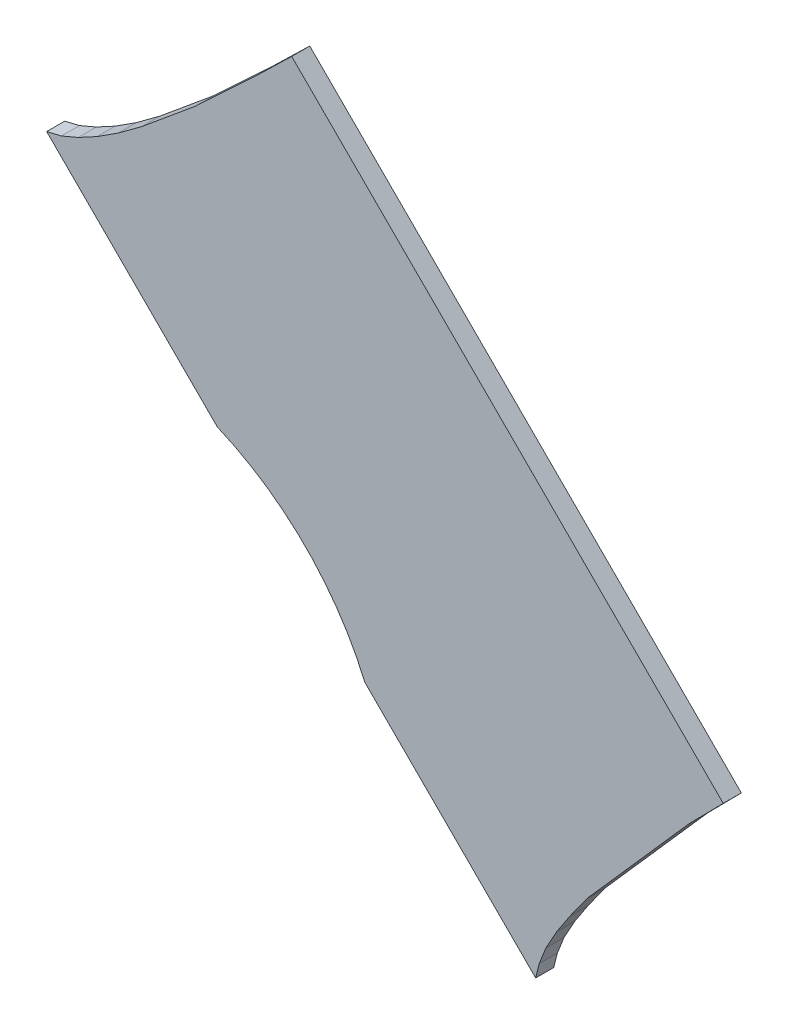
ISO-10303-21;
HEADER;
FILE_DESCRIPTION(('STEP AP214'),'2;1');
FILE_NAME('part.step','',(''),(''),'','','');
FILE_SCHEMA(('AUTOMOTIVE_DESIGN { 1 0 10303 214 1 1 1 1 }'));
ENDSEC;
DATA;
#1=APPLICATION_CONTEXT('core data for automotive mechanical design processes');
#2=APPLICATION_PROTOCOL_DEFINITION('international standard','automotive_design',2000,#1);
#3=PRODUCT_CONTEXT('',#1,'mechanical');
#4=PRODUCT('Part','Part','',(#3));
#5=PRODUCT_RELATED_PRODUCT_CATEGORY('part','',(#4));
#6=PRODUCT_DEFINITION_FORMATION('','',#4);
#7=PRODUCT_DEFINITION_CONTEXT('part definition',#1,'design');
#8=PRODUCT_DEFINITION('design','',#6,#7);
#9=PRODUCT_DEFINITION_SHAPE('','',#8);
#10=(LENGTH_UNIT() NAMED_UNIT(*) SI_UNIT(.MILLI.,.METRE.));
#11=(NAMED_UNIT(*) PLANE_ANGLE_UNIT() SI_UNIT($,.RADIAN.));
#12=(NAMED_UNIT(*) SI_UNIT($,.STERADIAN.) SOLID_ANGLE_UNIT());
#13=UNCERTAINTY_MEASURE_WITH_UNIT(LENGTH_MEASURE(1.E-05),#10,'distance_accuracy_value','');
#14=(GEOMETRIC_REPRESENTATION_CONTEXT(3) GLOBAL_UNCERTAINTY_ASSIGNED_CONTEXT((#13)) GLOBAL_UNIT_ASSIGNED_CONTEXT((#10,
#11,#12)) REPRESENTATION_CONTEXT('',''));
#15=CARTESIAN_POINT('',(0.,0.,0.));
#16=DIRECTION('',(0.,0.,1.));
#17=DIRECTION('',(1.,0.,0.));
#18=AXIS2_PLACEMENT_3D('',#15,#16,#17);
#19=CARTESIAN_POINT('',(97.9150009155273,57.5989990234375,0.));
#20=DIRECTION('',(-0.706690206684728,-0.707523110418236,0.));
#21=DIRECTION('',(-0.707523110418236,0.706690206684728,0.));
#22=AXIS2_PLACEMENT_3D('',#19,#20,#21);
#23=PLANE('',#22);
#24=DIRECTION('',(-0.707523110418236,0.706690206684728,0.));
#25=VECTOR('',#24,1.);
#26=CARTESIAN_POINT('',(97.9150009155273,57.5989990234375,0.03556));
#27=LINE('',#26,#25);
#28=CARTESIAN_POINT('',(97.9150009155273,57.5989990234375,0.03556));
#29=VERTEX_POINT('',#28);
#30=CARTESIAN_POINT('',(97.0660018920898,58.4469985961914,0.03556));
#31=VERTEX_POINT('',#30);
#32=EDGE_CURVE('E11',#29,#31,#27,.T.);
#33=ORIENTED_EDGE('',*,*,#32,.F.);
#34=DIRECTION('',(0.,0.,1.));
#35=VECTOR('',#34,1.);
#36=CARTESIAN_POINT('',(97.9150009155273,57.5989990234375,0.));
#37=LINE('',#36,#35);
#38=CARTESIAN_POINT('',(97.9150009155273,57.5989990234375,0.));
#39=VERTEX_POINT('',#38);
#40=EDGE_CURVE('E24',#39,#29,#37,.T.);
#41=ORIENTED_EDGE('',*,*,#40,.F.);
#42=DIRECTION('',(-0.707523110418236,0.706690206684728,0.));
#43=VECTOR('',#42,1.);
#44=CARTESIAN_POINT('',(97.9150009155273,57.5989990234375,0.));
#45=LINE('',#44,#43);
#46=CARTESIAN_POINT('',(97.0660018920898,58.4469985961914,0.));
#47=VERTEX_POINT('',#46);
#48=EDGE_CURVE('E297',#39,#47,#45,.T.);
#49=ORIENTED_EDGE('',*,*,#48,.T.);
#50=DIRECTION('',(0.,0.,1.));
#51=VECTOR('',#50,1.);
#52=CARTESIAN_POINT('',(97.0660018920898,58.4469985961914,0.));
#53=LINE('',#52,#51);
#54=EDGE_CURVE('E37',#47,#31,#53,.T.);
#55=ORIENTED_EDGE('',*,*,#54,.T.);
#56=EDGE_LOOP('',(#33,#41,#49,#55));
#57=FACE_BOUND('',#56,.T.);
#58=ADVANCED_FACE('F17',(#57),#23,.F.);
#59=CARTESIAN_POINT('',(97.8479995727539,57.5309982299805,0.));
#60=DIRECTION('',(-0.712322129038373,0.701852680042072,0.));
#61=DIRECTION('',(0.701852680042072,0.712322129038373,0.));
#62=AXIS2_PLACEMENT_3D('',#59,#60,#61);
#63=PLANE('',#62);
#64=DIRECTION('',(0.701852680042072,0.712322129038373,0.));
#65=VECTOR('',#64,1.);
#66=CARTESIAN_POINT('',(97.8479995727539,57.5309982299805,0.03556));
#67=LINE('',#66,#65);
#68=CARTESIAN_POINT('',(97.8479995727539,57.5309982299805,0.03556));
#69=VERTEX_POINT('',#68);
#70=EDGE_CURVE('E293',#69,#29,#67,.T.);
#71=ORIENTED_EDGE('',*,*,#70,.F.);
#72=DIRECTION('',(0.,0.,1.));
#73=VECTOR('',#72,1.);
#74=CARTESIAN_POINT('',(97.8479995727539,57.5309982299805,0.));
#75=LINE('',#74,#73);
#76=CARTESIAN_POINT('',(97.8479995727539,57.5309982299805,0.));
#77=VERTEX_POINT('',#76);
#78=EDGE_CURVE('E291',#77,#69,#75,.T.);
#79=ORIENTED_EDGE('',*,*,#78,.F.);
#80=DIRECTION('',(0.701852680042072,0.712322129038373,0.));
#81=VECTOR('',#80,1.);
#82=CARTESIAN_POINT('',(97.8479995727539,57.5309982299805,0.));
#83=LINE('',#82,#81);
#84=EDGE_CURVE('E289',#77,#39,#83,.T.);
#85=ORIENTED_EDGE('',*,*,#84,.T.);
#86=ORIENTED_EDGE('',*,*,#40,.T.);
#87=EDGE_LOOP('',(#71,#79,#85,#86));
#88=FACE_BOUND('',#87,.T.);
#89=ADVANCED_FACE('F300',(#88),#63,.F.);
#90=CARTESIAN_POINT('',(97.6470031738281,57.3030014038086,0.));
#91=DIRECTION('',(-0.750127132256112,0.661293645405142,0.));
#92=DIRECTION('',(0.661293645405142,0.750127132256112,0.));
#93=AXIS2_PLACEMENT_3D('',#90,#91,#92);
#94=PLANE('',#93);
#95=DIRECTION('',(0.661293645405142,0.750127132256112,0.));
#96=VECTOR('',#95,1.);
#97=CARTESIAN_POINT('',(97.6470031738281,57.3030014038086,0.03556));
#98=LINE('',#97,#96);
#99=CARTESIAN_POINT('',(97.6470031738281,57.3030014038086,0.03556));
#100=VERTEX_POINT('',#99);
#101=EDGE_CURVE('E286',#100,#69,#98,.T.);
#102=ORIENTED_EDGE('',*,*,#101,.F.);
#103=DIRECTION('',(0.,0.,1.));
#104=VECTOR('',#103,1.);
#105=CARTESIAN_POINT('',(97.6470031738281,57.3030014038086,0.));
#106=LINE('',#105,#104);
#107=CARTESIAN_POINT('',(97.6470031738281,57.3030014038086,0.));
#108=VERTEX_POINT('',#107);
#109=EDGE_CURVE('E284',#108,#100,#106,.T.);
#110=ORIENTED_EDGE('',*,*,#109,.F.);
#111=DIRECTION('',(0.661293645405142,0.750127132256112,0.));
#112=VECTOR('',#111,1.);
#113=CARTESIAN_POINT('',(97.6470031738281,57.3030014038086,0.));
#114=LINE('',#113,#112);
#115=EDGE_CURVE('E281',#108,#77,#114,.T.);
#116=ORIENTED_EDGE('',*,*,#115,.T.);
#117=ORIENTED_EDGE('',*,*,#78,.T.);
#118=EDGE_LOOP('',(#102,#110,#116,#117));
#119=FACE_BOUND('',#118,.T.);
#120=ADVANCED_FACE('F303',(#119),#94,.F.);
#121=CARTESIAN_POINT('',(97.6139984130859,57.2569999694824,0.));
#122=DIRECTION('',(-0.81250703080477,0.582951391535191,0.));
#123=DIRECTION('',(0.582951391535191,0.81250703080477,0.));
#124=AXIS2_PLACEMENT_3D('',#121,#122,#123);
#125=PLANE('',#124);
#126=DIRECTION('',(0.582951391535191,0.81250703080477,0.));
#127=VECTOR('',#126,1.);
#128=CARTESIAN_POINT('',(97.6139984130859,57.2569999694824,0.03556));
#129=LINE('',#128,#127);
#130=CARTESIAN_POINT('',(97.6139984130859,57.2569999694824,0.03556));
#131=VERTEX_POINT('',#130);
#132=EDGE_CURVE('E278',#131,#100,#129,.T.);
#133=ORIENTED_EDGE('',*,*,#132,.F.);
#134=DIRECTION('',(0.,0.,1.));
#135=VECTOR('',#134,1.);
#136=CARTESIAN_POINT('',(97.6139984130859,57.2569999694824,0.));
#137=LINE('',#136,#135);
#138=CARTESIAN_POINT('',(97.6139984130859,57.2569999694824,0.));
#139=VERTEX_POINT('',#138);
#140=EDGE_CURVE('E276',#139,#131,#137,.T.);
#141=ORIENTED_EDGE('',*,*,#140,.F.);
#142=DIRECTION('',(0.582951391535191,0.81250703080477,0.));
#143=VECTOR('',#142,1.);
#144=CARTESIAN_POINT('',(97.6139984130859,57.2569999694824,0.));
#145=LINE('',#144,#143);
#146=EDGE_CURVE('E273',#139,#108,#145,.T.);
#147=ORIENTED_EDGE('',*,*,#146,.T.);
#148=ORIENTED_EDGE('',*,*,#109,.T.);
#149=EDGE_LOOP('',(#133,#141,#147,#148));
#150=FACE_BOUND('',#149,.T.);
#151=ADVANCED_FACE('F308',(#150),#125,.F.);
#152=CARTESIAN_POINT('',(97.5869979858398,57.2159996032715,0.));
#153=DIRECTION('',(-0.835169123716599,0.549993213403991,0.));
#154=DIRECTION('',(0.549993213403991,0.835169123716599,0.));
#155=AXIS2_PLACEMENT_3D('',#152,#153,#154);
#156=PLANE('',#155);
#157=DIRECTION('',(0.549993213403991,0.835169123716599,0.));
#158=VECTOR('',#157,1.);
#159=CARTESIAN_POINT('',(97.5869979858398,57.2159996032715,0.03556));
#160=LINE('',#159,#158);
#161=CARTESIAN_POINT('',(97.5869979858398,57.2159996032715,0.03556));
#162=VERTEX_POINT('',#161);
#163=EDGE_CURVE('E270',#162,#131,#160,.T.);
#164=ORIENTED_EDGE('',*,*,#163,.F.);
#165=DIRECTION('',(0.,0.,1.));
#166=VECTOR('',#165,1.);
#167=CARTESIAN_POINT('',(97.5869979858398,57.2159996032715,0.));
#168=LINE('',#167,#166);
#169=CARTESIAN_POINT('',(97.5869979858398,57.2159996032715,0.));
#170=VERTEX_POINT('',#169);
#171=EDGE_CURVE('E268',#170,#162,#168,.T.);
#172=ORIENTED_EDGE('',*,*,#171,.F.);
#173=DIRECTION('',(0.549993213403991,0.835169123716599,0.));
#174=VECTOR('',#173,1.);
#175=CARTESIAN_POINT('',(97.5869979858398,57.2159996032715,0.));
#176=LINE('',#175,#174);
#177=EDGE_CURVE('E265',#170,#139,#176,.T.);
#178=ORIENTED_EDGE('',*,*,#177,.T.);
#179=ORIENTED_EDGE('',*,*,#140,.T.);
#180=EDGE_LOOP('',(#164,#172,#178,#179));
#181=FACE_BOUND('',#180,.T.);
#182=ADVANCED_FACE('F311',(#181),#156,.F.);
#183=CARTESIAN_POINT('',(97.5660018920898,57.1780014038086,0.));
#184=DIRECTION('',(-0.875269922598905,0.4836347408879,0.));
#185=DIRECTION('',(0.4836347408879,0.875269922598905,0.));
#186=AXIS2_PLACEMENT_3D('',#183,#184,#185);
#187=PLANE('',#186);
#188=DIRECTION('',(0.4836347408879,0.875269922598905,0.));
#189=VECTOR('',#188,1.);
#190=CARTESIAN_POINT('',(97.5660018920898,57.1780014038086,0.03556));
#191=LINE('',#190,#189);
#192=CARTESIAN_POINT('',(97.5660018920898,57.1780014038086,0.03556));
#193=VERTEX_POINT('',#192);
#194=EDGE_CURVE('E262',#193,#162,#191,.T.);
#195=ORIENTED_EDGE('',*,*,#194,.F.);
#196=DIRECTION('',(0.,0.,1.));
#197=VECTOR('',#196,1.);
#198=CARTESIAN_POINT('',(97.5660018920898,57.1780014038086,0.));
#199=LINE('',#198,#197);
#200=CARTESIAN_POINT('',(97.5660018920898,57.1780014038086,0.));
#201=VERTEX_POINT('',#200);
#202=EDGE_CURVE('E260',#201,#193,#199,.T.);
#203=ORIENTED_EDGE('',*,*,#202,.F.);
#204=DIRECTION('',(0.4836347408879,0.875269922598905,0.));
#205=VECTOR('',#204,1.);
#206=CARTESIAN_POINT('',(97.5660018920898,57.1780014038086,0.));
#207=LINE('',#206,#205);
#208=EDGE_CURVE('E257',#201,#170,#207,.T.);
#209=ORIENTED_EDGE('',*,*,#208,.T.);
#210=ORIENTED_EDGE('',*,*,#171,.T.);
#211=EDGE_LOOP('',(#195,#203,#209,#210));
#212=FACE_BOUND('',#211,.T.);
#213=ADVANCED_FACE('F316',(#212),#187,.F.);
#214=CARTESIAN_POINT('',(97.5530014038086,57.1450004577637,0.));
#215=DIRECTION('',(-0.930407281415099,0.36652733962116,0.));
#216=DIRECTION('',(0.36652733962116,0.930407281415099,0.));
#217=AXIS2_PLACEMENT_3D('',#214,#215,#216);
#218=PLANE('',#217);
#219=DIRECTION('',(0.36652733962116,0.930407281415099,0.));
#220=VECTOR('',#219,1.);
#221=CARTESIAN_POINT('',(97.5530014038086,57.1450004577637,0.03556));
#222=LINE('',#221,#220);
#223=CARTESIAN_POINT('',(97.5530014038086,57.1450004577637,0.03556));
#224=VERTEX_POINT('',#223);
#225=EDGE_CURVE('E254',#224,#193,#222,.T.);
#226=ORIENTED_EDGE('',*,*,#225,.F.);
#227=DIRECTION('',(0.,0.,1.));
#228=VECTOR('',#227,1.);
#229=CARTESIAN_POINT('',(97.5530014038086,57.1450004577637,0.));
#230=LINE('',#229,#228);
#231=CARTESIAN_POINT('',(97.5530014038086,57.1450004577637,0.));
#232=VERTEX_POINT('',#231);
#233=EDGE_CURVE('E252',#232,#224,#230,.T.);
#234=ORIENTED_EDGE('',*,*,#233,.F.);
#235=DIRECTION('',(0.36652733962116,0.930407281415099,0.));
#236=VECTOR('',#235,1.);
#237=CARTESIAN_POINT('',(97.5530014038086,57.1450004577637,0.));
#238=LINE('',#237,#236);
#239=EDGE_CURVE('E249',#232,#201,#238,.T.);
#240=ORIENTED_EDGE('',*,*,#239,.T.);
#241=ORIENTED_EDGE('',*,*,#202,.T.);
#242=EDGE_LOOP('',(#226,#234,#240,#241));
#243=FACE_BOUND('',#242,.T.);
#244=ADVANCED_FACE('F319',(#243),#218,.F.);
#245=CARTESIAN_POINT('',(97.5459976196289,57.117000579834,0.));
#246=DIRECTION('',(-0.970111393872779,0.242660016233028,0.));
#247=DIRECTION('',(0.242660016233028,0.970111393872779,0.));
#248=AXIS2_PLACEMENT_3D('',#245,#246,#247);
#249=PLANE('',#248);
#250=DIRECTION('',(0.242660016233028,0.970111393872779,0.));
#251=VECTOR('',#250,1.);
#252=CARTESIAN_POINT('',(97.5459976196289,57.117000579834,0.03556));
#253=LINE('',#252,#251);
#254=CARTESIAN_POINT('',(97.5459976196289,57.117000579834,0.03556));
#255=VERTEX_POINT('',#254);
#256=EDGE_CURVE('E246',#255,#224,#253,.T.);
#257=ORIENTED_EDGE('',*,*,#256,.F.);
#258=DIRECTION('',(0.,0.,1.));
#259=VECTOR('',#258,1.);
#260=CARTESIAN_POINT('',(97.5459976196289,57.117000579834,0.));
#261=LINE('',#260,#259);
#262=CARTESIAN_POINT('',(97.5459976196289,57.117000579834,0.));
#263=VERTEX_POINT('',#262);
#264=EDGE_CURVE('E244',#263,#255,#261,.T.);
#265=ORIENTED_EDGE('',*,*,#264,.F.);
#266=DIRECTION('',(0.242660016233028,0.970111393872779,0.));
#267=VECTOR('',#266,1.);
#268=CARTESIAN_POINT('',(97.5459976196289,57.117000579834,0.));
#269=LINE('',#268,#267);
#270=EDGE_CURVE('E241',#263,#232,#269,.T.);
#271=ORIENTED_EDGE('',*,*,#270,.T.);
#272=ORIENTED_EDGE('',*,*,#233,.T.);
#273=EDGE_LOOP('',(#257,#265,#271,#272));
#274=FACE_BOUND('',#273,.T.);
#275=ADVANCED_FACE('F324',(#274),#249,.F.);
#276=CARTESIAN_POINT('',(97.2099402488561,57.4527088097833,0.));
#277=DIRECTION('',(0.70673917682214,0.707474194543351,0.));
#278=DIRECTION('',(0.707474194543351,-0.70673917682214,0.));
#279=AXIS2_PLACEMENT_3D('',#276,#277,#278);
#280=PLANE('',#279);
#281=DIRECTION('',(0.707474194543351,-0.70673917682214,0.));
#282=VECTOR('',#281,1.);
#283=CARTESIAN_POINT('',(96.5839996337891,58.0779991149902,0.03556));
#284=LINE('',#283,#282);
#285=CARTESIAN_POINT('',(97.2099402488561,57.4527088097833,0.03556));
#286=VERTEX_POINT('',#285);
#287=EDGE_CURVE('E238',#286,#255,#284,.T.);
#288=ORIENTED_EDGE('',*,*,#287,.F.);
#289=DIRECTION('',(0.,0.,1.));
#290=VECTOR('',#289,1.);
#291=CARTESIAN_POINT('',(97.2099402488561,57.4527088097833,0.));
#292=LINE('',#291,#290);
#293=CARTESIAN_POINT('',(97.2099402488561,57.4527088097833,0.));
#294=VERTEX_POINT('',#293);
#295=EDGE_CURVE('E236',#294,#286,#292,.T.);
#296=ORIENTED_EDGE('',*,*,#295,.F.);
#297=DIRECTION('',(0.707474194543351,-0.70673917682214,0.));
#298=VECTOR('',#297,1.);
#299=CARTESIAN_POINT('',(96.5839996337891,58.0779991149902,0.));
#300=LINE('',#299,#298);
#301=EDGE_CURVE('E233',#294,#263,#300,.T.);
#302=ORIENTED_EDGE('',*,*,#301,.T.);
#303=ORIENTED_EDGE('',*,*,#264,.T.);
#304=EDGE_LOOP('',(#288,#296,#302,#303));
#305=FACE_BOUND('',#304,.T.);
#306=ADVANCED_FACE('F327',(#305),#280,.F.);
#307=CARTESIAN_POINT('',(96.70415,57.2366648,0.));
#308=DIRECTION('',(0.,0.,-1.));
#309=DIRECTION('',(1.,0.,0.));
#310=AXIS2_PLACEMENT_3D('',#307,#308,#309);
#311=CYLINDRICAL_SURFACE('',#310,0.5499989);
#312=ORIENTED_EDGE('',*,*,#295,.T.);
#313=CARTESIAN_POINT('',(96.70415,57.2366648,0.03556));
#314=DIRECTION('',(0.,0.,1.));
#315=DIRECTION('',(1.,0.,0.));
#316=AXIS2_PLACEMENT_3D('',#313,#314,#315);
#317=CIRCLE('',#316,0.5499989);
#318=CARTESIAN_POINT('',(96.9196681383196,57.7426793472775,0.03556));
#319=VERTEX_POINT('',#318);
#320=EDGE_CURVE('E230',#286,#319,#317,.T.);
#321=ORIENTED_EDGE('',*,*,#320,.T.);
#322=DIRECTION('',(0.,0.,1.));
#323=VECTOR('',#322,1.);
#324=CARTESIAN_POINT('',(96.9196681383196,57.7426793472775,0.));
#325=LINE('',#324,#323);
#326=CARTESIAN_POINT('',(96.9196681383196,57.7426793472775,0.));
#327=VERTEX_POINT('',#326);
#328=EDGE_CURVE('E228',#327,#319,#325,.T.);
#329=ORIENTED_EDGE('',*,*,#328,.F.);
#330=CARTESIAN_POINT('',(96.70415,57.2366648,0.));
#331=DIRECTION('',(0.,0.,1.));
#332=DIRECTION('',(1.,0.,0.));
#333=AXIS2_PLACEMENT_3D('',#330,#331,#332);
#334=CIRCLE('',#333,0.5499989);
#335=EDGE_CURVE('E225',#294,#327,#334,.T.);
#336=ORIENTED_EDGE('',*,*,#335,.F.);
#337=EDGE_LOOP('',(#312,#321,#329,#336));
#338=FACE_BOUND('',#337,.T.);
#339=ADVANCED_FACE('F333',(#338),#311,.F.);
#340=CARTESIAN_POINT('',(96.5839996337891,58.0779991149902,0.));
#341=DIRECTION('',(0.70673917682214,0.707474194543351,0.));
#342=DIRECTION('',(0.707474194543351,-0.70673917682214,0.));
#343=AXIS2_PLACEMENT_3D('',#340,#341,#342);
#344=PLANE('',#343);
#345=DIRECTION('',(0.707474194543351,-0.70673917682214,0.));
#346=VECTOR('',#345,1.);
#347=CARTESIAN_POINT('',(96.5839996337891,58.0779991149902,0.03556));
#348=LINE('',#347,#346);
#349=CARTESIAN_POINT('',(96.5839996337891,58.0779991149902,0.03556));
#350=VERTEX_POINT('',#349);
#351=EDGE_CURVE('E222',#350,#319,#348,.T.);
#352=ORIENTED_EDGE('',*,*,#351,.F.);
#353=DIRECTION('',(0.,0.,1.));
#354=VECTOR('',#353,1.);
#355=CARTESIAN_POINT('',(96.5839996337891,58.0779991149902,0.));
#356=LINE('',#355,#354);
#357=CARTESIAN_POINT('',(96.5839996337891,58.0779991149902,0.));
#358=VERTEX_POINT('',#357);
#359=EDGE_CURVE('E220',#358,#350,#356,.T.);
#360=ORIENTED_EDGE('',*,*,#359,.F.);
#361=EDGE_CURVE('E219',#358,#327,#300,.T.);
#362=ORIENTED_EDGE('',*,*,#361,.T.);
#363=ORIENTED_EDGE('',*,*,#328,.T.);
#364=EDGE_LOOP('',(#352,#360,#362,#363));
#365=FACE_BOUND('',#364,.T.);
#366=ADVANCED_FACE('F336',(#365),#344,.F.);
#367=CARTESIAN_POINT('',(96.6129989624023,58.0849990844727,0.));
#368=DIRECTION('',(0.234644699710009,-0.972081202831327,0.));
#369=DIRECTION('',(-0.972081202831327,-0.234644699710009,0.));
#370=AXIS2_PLACEMENT_3D('',#367,#368,#369);
#371=PLANE('',#370);
#372=DIRECTION('',(-0.972081202831327,-0.234644699710009,0.));
#373=VECTOR('',#372,1.);
#374=CARTESIAN_POINT('',(96.6129989624023,58.0849990844727,0.03556));
#375=LINE('',#374,#373);
#376=CARTESIAN_POINT('',(96.6129989624023,58.0849990844727,0.03556));
#377=VERTEX_POINT('',#376);
#378=EDGE_CURVE('E216',#377,#350,#375,.T.);
#379=ORIENTED_EDGE('',*,*,#378,.F.);
#380=DIRECTION('',(0.,0.,1.));
#381=VECTOR('',#380,1.);
#382=CARTESIAN_POINT('',(96.6129989624023,58.0849990844727,0.));
#383=LINE('',#382,#381);
#384=CARTESIAN_POINT('',(96.6129989624023,58.0849990844727,0.));
#385=VERTEX_POINT('',#384);
#386=EDGE_CURVE('E214',#385,#377,#383,.T.);
#387=ORIENTED_EDGE('',*,*,#386,.F.);
#388=DIRECTION('',(-0.972081202831327,-0.234644699710009,0.));
#389=VECTOR('',#388,1.);
#390=CARTESIAN_POINT('',(96.6129989624023,58.0849990844727,0.));
#391=LINE('',#390,#389);
#392=EDGE_CURVE('E211',#385,#358,#391,.T.);
#393=ORIENTED_EDGE('',*,*,#392,.T.);
#394=ORIENTED_EDGE('',*,*,#359,.T.);
#395=EDGE_LOOP('',(#379,#387,#393,#394));
#396=FACE_BOUND('',#395,.T.);
#397=ADVANCED_FACE('F341',(#396),#371,.F.);
#398=CARTESIAN_POINT('',(96.6460037231445,58.0989990234375,0.));
#399=DIRECTION('',(0.390500660579544,-0.920602647230031,0.));
#400=DIRECTION('',(-0.920602647230031,-0.390500660579544,0.));
#401=AXIS2_PLACEMENT_3D('',#398,#399,#400);
#402=PLANE('',#401);
#403=DIRECTION('',(-0.920602647230031,-0.390500660579544,0.));
#404=VECTOR('',#403,1.);
#405=CARTESIAN_POINT('',(96.6460037231445,58.0989990234375,0.03556));
#406=LINE('',#405,#404);
#407=CARTESIAN_POINT('',(96.6460037231445,58.0989990234375,0.03556));
#408=VERTEX_POINT('',#407);
#409=EDGE_CURVE('E208',#408,#377,#406,.T.);
#410=ORIENTED_EDGE('',*,*,#409,.F.);
#411=DIRECTION('',(0.,0.,1.));
#412=VECTOR('',#411,1.);
#413=CARTESIAN_POINT('',(96.6460037231445,58.0989990234375,0.));
#414=LINE('',#413,#412);
#415=CARTESIAN_POINT('',(96.6460037231445,58.0989990234375,0.));
#416=VERTEX_POINT('',#415);
#417=EDGE_CURVE('E206',#416,#408,#414,.T.);
#418=ORIENTED_EDGE('',*,*,#417,.F.);
#419=DIRECTION('',(-0.920602647230031,-0.390500660579544,0.));
#420=VECTOR('',#419,1.);
#421=CARTESIAN_POINT('',(96.6460037231445,58.0989990234375,0.));
#422=LINE('',#421,#420);
#423=EDGE_CURVE('E203',#416,#385,#422,.T.);
#424=ORIENTED_EDGE('',*,*,#423,.T.);
#425=ORIENTED_EDGE('',*,*,#386,.T.);
#426=EDGE_LOOP('',(#410,#418,#424,#425));
#427=FACE_BOUND('',#426,.T.);
#428=ADVANCED_FACE('F344',(#427),#402,.F.);
#429=CARTESIAN_POINT('',(96.6829986572266,58.1189994812012,0.));
#430=DIRECTION('',(0.475575846598537,-0.879674720639445,0.));
#431=DIRECTION('',(-0.879674720639445,-0.475575846598537,0.));
#432=AXIS2_PLACEMENT_3D('',#429,#430,#431);
#433=PLANE('',#432);
#434=DIRECTION('',(-0.879674720639445,-0.475575846598537,0.));
#435=VECTOR('',#434,1.);
#436=CARTESIAN_POINT('',(96.6829986572266,58.1189994812012,0.03556));
#437=LINE('',#436,#435);
#438=CARTESIAN_POINT('',(96.6829986572266,58.1189994812012,0.03556));
#439=VERTEX_POINT('',#438);
#440=EDGE_CURVE('E200',#439,#408,#437,.T.);
#441=ORIENTED_EDGE('',*,*,#440,.F.);
#442=DIRECTION('',(0.,0.,1.));
#443=VECTOR('',#442,1.);
#444=CARTESIAN_POINT('',(96.6829986572266,58.1189994812012,0.));
#445=LINE('',#444,#443);
#446=CARTESIAN_POINT('',(96.6829986572266,58.1189994812012,0.));
#447=VERTEX_POINT('',#446);
#448=EDGE_CURVE('E198',#447,#439,#445,.T.);
#449=ORIENTED_EDGE('',*,*,#448,.F.);
#450=DIRECTION('',(-0.879674720639445,-0.475575846598537,0.));
#451=VECTOR('',#450,1.);
#452=CARTESIAN_POINT('',(96.6829986572266,58.1189994812012,0.));
#453=LINE('',#452,#451);
#454=EDGE_CURVE('E195',#447,#416,#453,.T.);
#455=ORIENTED_EDGE('',*,*,#454,.T.);
#456=ORIENTED_EDGE('',*,*,#417,.T.);
#457=EDGE_LOOP('',(#441,#449,#455,#456));
#458=FACE_BOUND('',#457,.T.);
#459=ADVANCED_FACE('F349',(#458),#433,.F.);
#460=CARTESIAN_POINT('',(96.7249984741211,58.1459999084473,0.));
#461=DIRECTION('',(0.540765314121708,-0.841173510664031,0.));
#462=DIRECTION('',(-0.841173510664031,-0.540765314121708,0.));
#463=AXIS2_PLACEMENT_3D('',#460,#461,#462);
#464=PLANE('',#463);
#465=DIRECTION('',(-0.841173510664031,-0.540765314121708,0.));
#466=VECTOR('',#465,1.);
#467=CARTESIAN_POINT('',(96.7249984741211,58.1459999084473,0.03556));
#468=LINE('',#467,#466);
#469=CARTESIAN_POINT('',(96.7249984741211,58.1459999084473,0.03556));
#470=VERTEX_POINT('',#469);
#471=EDGE_CURVE('E192',#470,#439,#468,.T.);
#472=ORIENTED_EDGE('',*,*,#471,.F.);
#473=DIRECTION('',(0.,0.,1.));
#474=VECTOR('',#473,1.);
#475=CARTESIAN_POINT('',(96.7249984741211,58.1459999084473,0.));
#476=LINE('',#475,#474);
#477=CARTESIAN_POINT('',(96.7249984741211,58.1459999084473,0.));
#478=VERTEX_POINT('',#477);
#479=EDGE_CURVE('E190',#478,#470,#476,.T.);
#480=ORIENTED_EDGE('',*,*,#479,.F.);
#481=DIRECTION('',(-0.841173510664031,-0.540765314121708,0.));
#482=VECTOR('',#481,1.);
#483=CARTESIAN_POINT('',(96.7249984741211,58.1459999084473,0.));
#484=LINE('',#483,#482);
#485=EDGE_CURVE('E187',#478,#447,#484,.T.);
#486=ORIENTED_EDGE('',*,*,#485,.T.);
#487=ORIENTED_EDGE('',*,*,#448,.T.);
#488=EDGE_LOOP('',(#472,#480,#486,#487));
#489=FACE_BOUND('',#488,.T.);
#490=ADVANCED_FACE('F352',(#489),#464,.F.);
#491=CARTESIAN_POINT('',(96.7710037231445,58.1800003051758,0.));
#492=DIRECTION('',(0.594351686019328,-0.804205243284314,0.));
#493=DIRECTION('',(-0.804205243284314,-0.594351686019328,0.));
#494=AXIS2_PLACEMENT_3D('',#491,#492,#493);
#495=PLANE('',#494);
#496=DIRECTION('',(-0.804205243284314,-0.594351686019328,0.));
#497=VECTOR('',#496,1.);
#498=CARTESIAN_POINT('',(96.7710037231445,58.1800003051758,0.03556));
#499=LINE('',#498,#497);
#500=CARTESIAN_POINT('',(96.7710037231445,58.1800003051758,0.03556));
#501=VERTEX_POINT('',#500);
#502=EDGE_CURVE('E184',#501,#470,#499,.T.);
#503=ORIENTED_EDGE('',*,*,#502,.F.);
#504=DIRECTION('',(0.,0.,1.));
#505=VECTOR('',#504,1.);
#506=CARTESIAN_POINT('',(96.7710037231445,58.1800003051758,0.));
#507=LINE('',#506,#505);
#508=CARTESIAN_POINT('',(96.7710037231445,58.1800003051758,0.));
#509=VERTEX_POINT('',#508);
#510=EDGE_CURVE('E182',#509,#501,#507,.T.);
#511=ORIENTED_EDGE('',*,*,#510,.F.);
#512=DIRECTION('',(-0.804205243284314,-0.594351686019328,0.));
#513=VECTOR('',#512,1.);
#514=CARTESIAN_POINT('',(96.7710037231445,58.1800003051758,0.));
#515=LINE('',#514,#513);
#516=EDGE_CURVE('E179',#509,#478,#515,.T.);
#517=ORIENTED_EDGE('',*,*,#516,.T.);
#518=ORIENTED_EDGE('',*,*,#479,.T.);
#519=EDGE_LOOP('',(#503,#511,#517,#518));
#520=FACE_BOUND('',#519,.T.);
#521=ADVANCED_FACE('F355',(#520),#495,.F.);
#522=CARTESIAN_POINT('',(96.8759994506836,58.2669982910156,0.));
#523=DIRECTION('',(0.638024499926341,-0.770016063140077,0.));
#524=DIRECTION('',(-0.770016063140077,-0.638024499926341,0.));
#525=AXIS2_PLACEMENT_3D('',#522,#523,#524);
#526=PLANE('',#525);
#527=DIRECTION('',(-0.770016063140077,-0.63802449992634,0.));
#528=VECTOR('',#527,1.);
#529=CARTESIAN_POINT('',(96.8759994506836,58.2669982910156,0.03556));
#530=LINE('',#529,#528);
#531=CARTESIAN_POINT('',(96.8759994506836,58.2669982910156,0.03556));
#532=VERTEX_POINT('',#531);
#533=EDGE_CURVE('E176',#532,#501,#530,.T.);
#534=ORIENTED_EDGE('',*,*,#533,.F.);
#535=DIRECTION('',(0.,0.,1.));
#536=VECTOR('',#535,1.);
#537=CARTESIAN_POINT('',(96.8759994506836,58.2669982910156,0.));
#538=LINE('',#537,#536);
#539=CARTESIAN_POINT('',(96.8759994506836,58.2669982910156,0.));
#540=VERTEX_POINT('',#539);
#541=EDGE_CURVE('E174',#540,#532,#538,.T.);
#542=ORIENTED_EDGE('',*,*,#541,.F.);
#543=DIRECTION('',(-0.770016063140077,-0.63802449992634,0.));
#544=VECTOR('',#543,1.);
#545=CARTESIAN_POINT('',(96.8759994506836,58.2669982910156,0.));
#546=LINE('',#545,#544);
#547=EDGE_CURVE('E165',#540,#509,#546,.T.);
#548=ORIENTED_EDGE('',*,*,#547,.T.);
#549=ORIENTED_EDGE('',*,*,#510,.T.);
#550=EDGE_LOOP('',(#534,#542,#548,#549));
#551=FACE_BOUND('',#550,.T.);
#552=ADVANCED_FACE('F358',(#551),#526,.F.);
#553=CARTESIAN_POINT('',(96.9980010986328,58.3810005187988,0.));
#554=DIRECTION('',(0.682747102364371,-0.730654770882292,0.));
#555=DIRECTION('',(-0.730654770882292,-0.682747102364371,0.));
#556=AXIS2_PLACEMENT_3D('',#553,#554,#555);
#557=PLANE('',#556);
#558=DIRECTION('',(-0.730654770882292,-0.682747102364371,0.));
#559=VECTOR('',#558,1.);
#560=CARTESIAN_POINT('',(96.9980010986328,58.3810005187988,0.03556));
#561=LINE('',#560,#559);
#562=CARTESIAN_POINT('',(96.9980010986328,58.3810005187988,0.03556));
#563=VERTEX_POINT('',#562);
#564=EDGE_CURVE('E151',#563,#532,#561,.T.);
#565=ORIENTED_EDGE('',*,*,#564,.F.);
#566=DIRECTION('',(0.,0.,1.));
#567=VECTOR('',#566,1.);
#568=CARTESIAN_POINT('',(96.9980010986328,58.3810005187988,0.));
#569=LINE('',#568,#567);
#570=CARTESIAN_POINT('',(96.9980010986328,58.3810005187988,0.));
#571=VERTEX_POINT('',#570);
#572=EDGE_CURVE('E146',#571,#563,#569,.T.);
#573=ORIENTED_EDGE('',*,*,#572,.F.);
#574=DIRECTION('',(-0.730654770882292,-0.682747102364371,0.));
#575=VECTOR('',#574,1.);
#576=CARTESIAN_POINT('',(96.9980010986328,58.3810005187988,0.));
#577=LINE('',#576,#575);
#578=EDGE_CURVE('E149',#571,#540,#577,.T.);
#579=ORIENTED_EDGE('',*,*,#578,.T.);
#580=ORIENTED_EDGE('',*,*,#541,.T.);
#581=EDGE_LOOP('',(#565,#573,#579,#580));
#582=FACE_BOUND('',#581,.T.);
#583=ADVANCED_FACE('F148',(#582),#557,.F.);
#584=CARTESIAN_POINT('',(97.0660018920898,58.4469985961914,0.));
#585=DIRECTION('',(0.696460745173529,-0.717594892980945,0.));
#586=DIRECTION('',(-0.717594892980945,-0.696460745173529,0.));
#587=AXIS2_PLACEMENT_3D('',#584,#585,#586);
#588=PLANE('',#587);
#589=DIRECTION('',(-0.717594892980945,-0.696460745173529,0.));
#590=VECTOR('',#589,1.);
#591=CARTESIAN_POINT('',(97.0660018920898,58.4469985961914,0.03556));
#592=LINE('',#591,#590);
#593=EDGE_CURVE('E166',#31,#563,#592,.T.);
#594=ORIENTED_EDGE('',*,*,#593,.F.);
#595=ORIENTED_EDGE('',*,*,#54,.F.);
#596=DIRECTION('',(-0.717594892980945,-0.696460745173529,0.));
#597=VECTOR('',#596,1.);
#598=CARTESIAN_POINT('',(97.0660018920898,58.4469985961914,0.));
#599=LINE('',#598,#597);
#600=EDGE_CURVE('E162',#47,#571,#599,.T.);
#601=ORIENTED_EDGE('',*,*,#600,.T.);
#602=ORIENTED_EDGE('',*,*,#572,.T.);
#603=EDGE_LOOP('',(#594,#595,#601,#602));
#604=FACE_BOUND('',#603,.T.);
#605=ADVANCED_FACE('F168',(#604),#588,.F.);
#606=CARTESIAN_POINT('',(97.0660018920898,58.4469985961914,0.));
#607=DIRECTION('',(0.,0.,1.));
#608=DIRECTION('',(1.,0.,0.));
#609=AXIS2_PLACEMENT_3D('',#606,#607,#608);
#610=PLANE('',#609);
#611=ORIENTED_EDGE('',*,*,#600,.F.);
#612=ORIENTED_EDGE('',*,*,#48,.F.);
#613=ORIENTED_EDGE('',*,*,#84,.F.);
#614=ORIENTED_EDGE('',*,*,#115,.F.);
#615=ORIENTED_EDGE('',*,*,#146,.F.);
#616=ORIENTED_EDGE('',*,*,#177,.F.);
#617=ORIENTED_EDGE('',*,*,#208,.F.);
#618=ORIENTED_EDGE('',*,*,#239,.F.);
#619=ORIENTED_EDGE('',*,*,#270,.F.);
#620=ORIENTED_EDGE('',*,*,#301,.F.);
#621=ORIENTED_EDGE('',*,*,#335,.T.);
#622=ORIENTED_EDGE('',*,*,#361,.F.);
#623=ORIENTED_EDGE('',*,*,#392,.F.);
#624=ORIENTED_EDGE('',*,*,#423,.F.);
#625=ORIENTED_EDGE('',*,*,#454,.F.);
#626=ORIENTED_EDGE('',*,*,#485,.F.);
#627=ORIENTED_EDGE('',*,*,#516,.F.);
#628=ORIENTED_EDGE('',*,*,#547,.F.);
#629=ORIENTED_EDGE('',*,*,#578,.F.);
#630=EDGE_LOOP('',(#611,#612,#613,#614,#615,#616,#617,#618,#619,#620,#621,#622,#623,#624,#625,
#626,#627,#628,#629));
#631=FACE_BOUND('',#630,.T.);
#632=ADVANCED_FACE('F160',(#631),#610,.F.);
#633=CARTESIAN_POINT('',(97.0660018920898,58.4469985961914,0.03556));
#634=DIRECTION('',(0.,0.,1.));
#635=DIRECTION('',(1.,0.,0.));
#636=AXIS2_PLACEMENT_3D('',#633,#634,#635);
#637=PLANE('',#636);
#638=ORIENTED_EDGE('',*,*,#32,.T.);
#639=ORIENTED_EDGE('',*,*,#593,.T.);
#640=ORIENTED_EDGE('',*,*,#564,.T.);
#641=ORIENTED_EDGE('',*,*,#533,.T.);
#642=ORIENTED_EDGE('',*,*,#502,.T.);
#643=ORIENTED_EDGE('',*,*,#471,.T.);
#644=ORIENTED_EDGE('',*,*,#440,.T.);
#645=ORIENTED_EDGE('',*,*,#409,.T.);
#646=ORIENTED_EDGE('',*,*,#378,.T.);
#647=ORIENTED_EDGE('',*,*,#351,.T.);
#648=ORIENTED_EDGE('',*,*,#320,.F.);
#649=ORIENTED_EDGE('',*,*,#287,.T.);
#650=ORIENTED_EDGE('',*,*,#256,.T.);
#651=ORIENTED_EDGE('',*,*,#225,.T.);
#652=ORIENTED_EDGE('',*,*,#194,.T.);
#653=ORIENTED_EDGE('',*,*,#163,.T.);
#654=ORIENTED_EDGE('',*,*,#132,.T.);
#655=ORIENTED_EDGE('',*,*,#101,.T.);
#656=ORIENTED_EDGE('',*,*,#70,.T.);
#657=EDGE_LOOP('',(#638,#639,#640,#641,#642,#643,#644,#645,#646,#647,#648,#649,#650,#651,#652,
#653,#654,#655,#656));
#658=FACE_BOUND('',#657,.T.);
#659=ADVANCED_FACE('F360',(#658),#637,.T.);
#660=CLOSED_SHELL('',(#58,#89,#120,#151,#182,#213,#244,#275,#306,#339,#366,#397,#428,#459,#490,
#521,#552,#583,#605,#632,#659));
#661=MANIFOLD_SOLID_BREP('B1',#660);
#662=ADVANCED_BREP_SHAPE_REPRESENTATION('',(#18,#661),#14);
#663=SHAPE_DEFINITION_REPRESENTATION(#9,#662);
ENDSEC;
END-ISO-10303-21;
